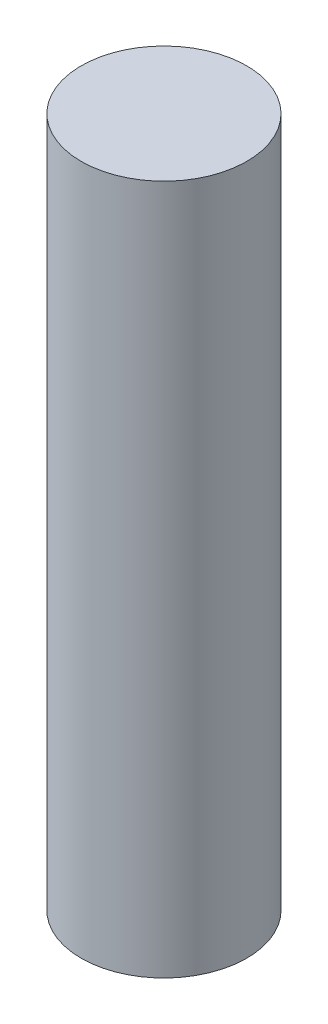
ISO-10303-21;
HEADER;
FILE_DESCRIPTION(('STEP AP214'),'2;1');
FILE_NAME('part.step','',(''),(''),'','','');
FILE_SCHEMA(('AUTOMOTIVE_DESIGN { 1 0 10303 214 1 1 1 1 }'));
ENDSEC;
DATA;
#1=APPLICATION_CONTEXT('core data for automotive mechanical design processes');
#2=APPLICATION_PROTOCOL_DEFINITION('international standard','automotive_design',2000,#1);
#3=PRODUCT_CONTEXT('',#1,'mechanical');
#4=PRODUCT('Part','Part','',(#3));
#5=PRODUCT_RELATED_PRODUCT_CATEGORY('part','',(#4));
#6=PRODUCT_DEFINITION_FORMATION('','',#4);
#7=PRODUCT_DEFINITION_CONTEXT('part definition',#1,'design');
#8=PRODUCT_DEFINITION('design','',#6,#7);
#9=PRODUCT_DEFINITION_SHAPE('','',#8);
#10=(LENGTH_UNIT() NAMED_UNIT(*) SI_UNIT(.MILLI.,.METRE.));
#11=(NAMED_UNIT(*) PLANE_ANGLE_UNIT() SI_UNIT($,.RADIAN.));
#12=(NAMED_UNIT(*) SI_UNIT($,.STERADIAN.) SOLID_ANGLE_UNIT());
#13=UNCERTAINTY_MEASURE_WITH_UNIT(LENGTH_MEASURE(1.E-05),#10,'distance_accuracy_value','');
#14=(GEOMETRIC_REPRESENTATION_CONTEXT(3) GLOBAL_UNCERTAINTY_ASSIGNED_CONTEXT((#13)) GLOBAL_UNIT_ASSIGNED_CONTEXT((#10,
#11,#12)) REPRESENTATION_CONTEXT('',''));
#15=CARTESIAN_POINT('',(0.,0.,0.));
#16=DIRECTION('',(0.,0.,1.));
#17=DIRECTION('',(1.,0.,0.));
#18=AXIS2_PLACEMENT_3D('',#15,#16,#17);
#19=CARTESIAN_POINT('',(0.,50.,0.));
#20=DIRECTION('',(0.,-1.,0.));
#21=DIRECTION('',(0.,0.,-1.));
#22=AXIS2_PLACEMENT_3D('',#19,#20,#21);
#23=CYLINDRICAL_SURFACE('',#22,6.);
#24=CARTESIAN_POINT('',(0.,50.,0.));
#25=DIRECTION('',(0.,1.,0.));
#26=DIRECTION('',(0.,0.,1.));
#27=AXIS2_PLACEMENT_3D('',#24,#25,#26);
#28=CIRCLE('',#27,6.);
#29=CARTESIAN_POINT('',(0.,50.,6.));
#30=VERTEX_POINT('',#29);
#31=EDGE_CURVE('E10',#30,#30,#28,.T.);
#32=ORIENTED_EDGE('',*,*,#31,.F.);
#33=EDGE_LOOP('',(#32));
#34=FACE_BOUND('',#33,.T.);
#35=CARTESIAN_POINT('',(0.,0.,0.));
#36=DIRECTION('',(0.,1.,0.));
#37=DIRECTION('',(0.,0.,1.));
#38=AXIS2_PLACEMENT_3D('',#35,#36,#37);
#39=CIRCLE('',#38,6.);
#40=CARTESIAN_POINT('',(0.,0.,6.));
#41=VERTEX_POINT('',#40);
#42=EDGE_CURVE('E37',#41,#41,#39,.T.);
#43=ORIENTED_EDGE('',*,*,#42,.T.);
#44=EDGE_LOOP('',(#43));
#45=FACE_BOUND('',#44,.T.);
#46=ADVANCED_FACE('F34',(#34,#45),#23,.T.);
#47=CARTESIAN_POINT('',(0.,50.,0.));
#48=DIRECTION('',(0.,1.,0.));
#49=DIRECTION('',(0.,0.,1.));
#50=AXIS2_PLACEMENT_3D('',#47,#48,#49);
#51=PLANE('',#50);
#52=ORIENTED_EDGE('',*,*,#31,.T.);
#53=EDGE_LOOP('',(#52));
#54=FACE_BOUND('',#53,.T.);
#55=ADVANCED_FACE('F49',(#54),#51,.T.);
#56=CARTESIAN_POINT('',(0.,0.,0.));
#57=DIRECTION('',(0.,1.,0.));
#58=DIRECTION('',(0.,0.,1.));
#59=AXIS2_PLACEMENT_3D('',#56,#57,#58);
#60=PLANE('',#59);
#61=ORIENTED_EDGE('',*,*,#42,.F.);
#62=EDGE_LOOP('',(#61));
#63=FACE_BOUND('',#62,.T.);
#64=ADVANCED_FACE('F47',(#63),#60,.F.);
#65=CLOSED_SHELL('',(#46,#55,#64));
#66=MANIFOLD_SOLID_BREP('B2',#65);
#67=ADVANCED_BREP_SHAPE_REPRESENTATION('',(#18,#66),#14);
#68=SHAPE_DEFINITION_REPRESENTATION(#9,#67);
ENDSEC;
END-ISO-10303-21;
